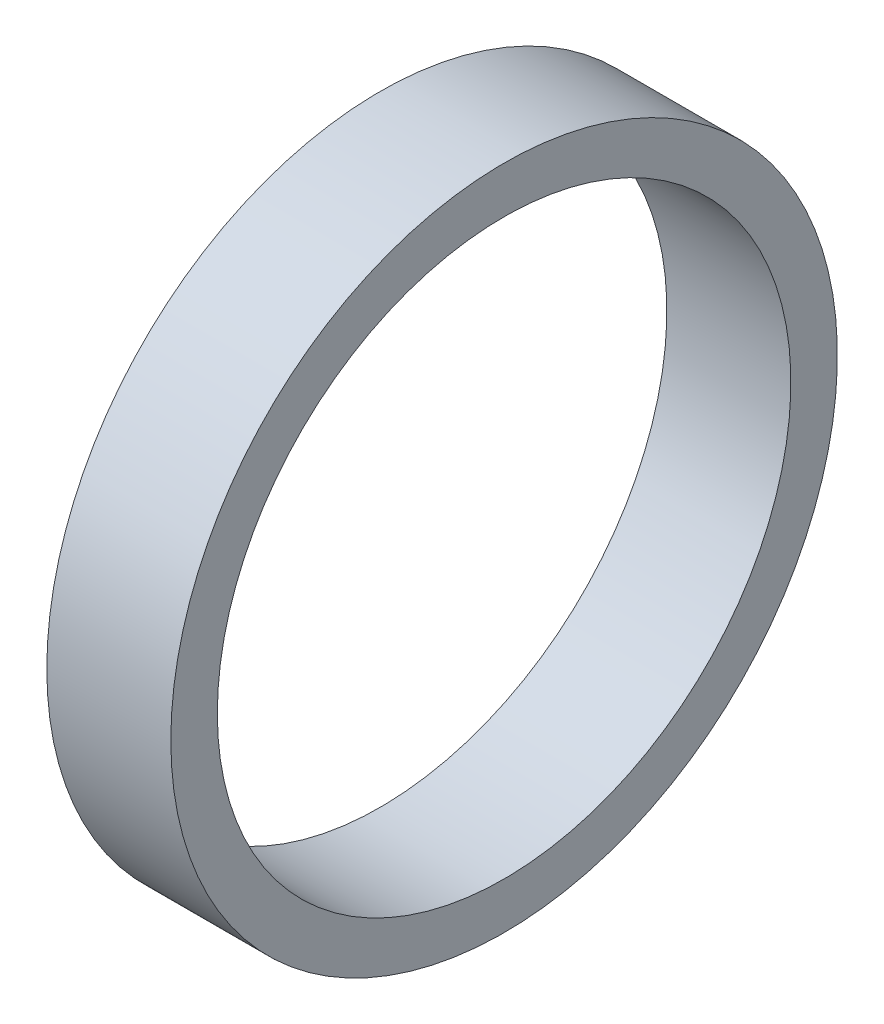
ISO-10303-21;
HEADER;
FILE_DESCRIPTION(('STEP AP214'),'2;1');
FILE_NAME('part.step','',(''),(''),'','','');
FILE_SCHEMA(('AUTOMOTIVE_DESIGN { 1 0 10303 214 1 1 1 1 }'));
ENDSEC;
DATA;
#1=APPLICATION_CONTEXT('core data for automotive mechanical design processes');
#2=APPLICATION_PROTOCOL_DEFINITION('international standard','automotive_design',2000,#1);
#3=PRODUCT_CONTEXT('',#1,'mechanical');
#4=PRODUCT('Part','Part','',(#3));
#5=PRODUCT_RELATED_PRODUCT_CATEGORY('part','',(#4));
#6=PRODUCT_DEFINITION_FORMATION('','',#4);
#7=PRODUCT_DEFINITION_CONTEXT('part definition',#1,'design');
#8=PRODUCT_DEFINITION('design','',#6,#7);
#9=PRODUCT_DEFINITION_SHAPE('','',#8);
#10=(LENGTH_UNIT() NAMED_UNIT(*) SI_UNIT(.MILLI.,.METRE.));
#11=(NAMED_UNIT(*) PLANE_ANGLE_UNIT() SI_UNIT($,.RADIAN.));
#12=(NAMED_UNIT(*) SI_UNIT($,.STERADIAN.) SOLID_ANGLE_UNIT());
#13=UNCERTAINTY_MEASURE_WITH_UNIT(LENGTH_MEASURE(1.E-05),#10,'distance_accuracy_value','');
#14=(GEOMETRIC_REPRESENTATION_CONTEXT(3) GLOBAL_UNCERTAINTY_ASSIGNED_CONTEXT((#13)) GLOBAL_UNIT_ASSIGNED_CONTEXT((#10,
#11,#12)) REPRESENTATION_CONTEXT('',''));
#15=CARTESIAN_POINT('',(0.,0.,0.));
#16=DIRECTION('',(0.,0.,1.));
#17=DIRECTION('',(1.,0.,0.));
#18=AXIS2_PLACEMENT_3D('',#15,#16,#17);
#19=CARTESIAN_POINT('',(-2.4,12.9,0.));
#20=DIRECTION('',(1.,0.,0.));
#21=DIRECTION('',(0.,0.,-1.));
#22=AXIS2_PLACEMENT_3D('',#19,#20,#21);
#23=PLANE('',#22);
#24=CARTESIAN_POINT('',(-2.4,0.,0.));
#25=DIRECTION('',(-1.,0.,0.));
#26=DIRECTION('',(0.,0.,1.));
#27=AXIS2_PLACEMENT_3D('',#24,#25,#26);
#28=CIRCLE('',#27,11.1);
#29=CARTESIAN_POINT('',(-2.4,0.,11.1));
#30=VERTEX_POINT('',#29);
#31=EDGE_CURVE('E10',#30,#30,#28,.T.);
#32=ORIENTED_EDGE('',*,*,#31,.F.);
#33=EDGE_LOOP('',(#32));
#34=FACE_BOUND('',#33,.T.);
#35=CARTESIAN_POINT('',(-2.4,0.,0.));
#36=DIRECTION('',(-1.,0.,0.));
#37=DIRECTION('',(0.,0.,1.));
#38=AXIS2_PLACEMENT_3D('',#35,#36,#37);
#39=CIRCLE('',#38,12.9);
#40=CARTESIAN_POINT('',(-2.4,0.,12.9));
#41=VERTEX_POINT('',#40);
#42=EDGE_CURVE('E54',#41,#41,#39,.T.);
#43=ORIENTED_EDGE('',*,*,#42,.T.);
#44=EDGE_LOOP('',(#43));
#45=FACE_BOUND('',#44,.T.);
#46=ADVANCED_FACE('F37',(#34,#45),#23,.F.);
#47=CARTESIAN_POINT('',(-110.,0.,0.));
#48=DIRECTION('',(-1.,0.,0.));
#49=DIRECTION('',(0.,0.,1.));
#50=AXIS2_PLACEMENT_3D('',#47,#48,#49);
#51=CYLINDRICAL_SURFACE('',#50,11.1);
#52=CARTESIAN_POINT('',(2.4,0.,0.));
#53=DIRECTION('',(-1.,0.,0.));
#54=DIRECTION('',(0.,0.,1.));
#55=AXIS2_PLACEMENT_3D('',#52,#53,#54);
#56=CIRCLE('',#55,11.1);
#57=CARTESIAN_POINT('',(2.4,0.,11.1));
#58=VERTEX_POINT('',#57);
#59=EDGE_CURVE('E44',#58,#58,#56,.T.);
#60=ORIENTED_EDGE('',*,*,#59,.F.);
#61=EDGE_LOOP('',(#60));
#62=FACE_BOUND('',#61,.T.);
#63=ORIENTED_EDGE('',*,*,#31,.T.);
#64=EDGE_LOOP('',(#63));
#65=FACE_BOUND('',#64,.T.);
#66=ADVANCED_FACE('F70',(#62,#65),#51,.F.);
#67=CARTESIAN_POINT('',(2.4,11.1,0.));
#68=DIRECTION('',(-1.,0.,0.));
#69=DIRECTION('',(0.,0.,1.));
#70=AXIS2_PLACEMENT_3D('',#67,#68,#69);
#71=PLANE('',#70);
#72=CARTESIAN_POINT('',(2.4,0.,0.));
#73=DIRECTION('',(-1.,0.,0.));
#74=DIRECTION('',(0.,0.,1.));
#75=AXIS2_PLACEMENT_3D('',#72,#73,#74);
#76=CIRCLE('',#75,12.9);
#77=CARTESIAN_POINT('',(2.4,0.,12.9));
#78=VERTEX_POINT('',#77);
#79=EDGE_CURVE('E49',#78,#78,#76,.T.);
#80=ORIENTED_EDGE('',*,*,#79,.F.);
#81=EDGE_LOOP('',(#80));
#82=FACE_BOUND('',#81,.T.);
#83=ORIENTED_EDGE('',*,*,#59,.T.);
#84=EDGE_LOOP('',(#83));
#85=FACE_BOUND('',#84,.T.);
#86=ADVANCED_FACE('F65',(#82,#85),#71,.F.);
#87=CARTESIAN_POINT('',(-110.,0.,0.));
#88=DIRECTION('',(-1.,0.,0.));
#89=DIRECTION('',(0.,0.,1.));
#90=AXIS2_PLACEMENT_3D('',#87,#88,#89);
#91=CYLINDRICAL_SURFACE('',#90,12.9);
#92=ORIENTED_EDGE('',*,*,#42,.F.);
#93=EDGE_LOOP('',(#92));
#94=FACE_BOUND('',#93,.T.);
#95=ORIENTED_EDGE('',*,*,#79,.T.);
#96=EDGE_LOOP('',(#95));
#97=FACE_BOUND('',#96,.T.);
#98=ADVANCED_FACE('F62',(#94,#97),#91,.T.);
#99=CLOSED_SHELL('',(#46,#66,#86,#98));
#100=MANIFOLD_SOLID_BREP('B2',#99);
#101=ADVANCED_BREP_SHAPE_REPRESENTATION('',(#18,#100),#14);
#102=SHAPE_DEFINITION_REPRESENTATION(#9,#101);
ENDSEC;
END-ISO-10303-21;
